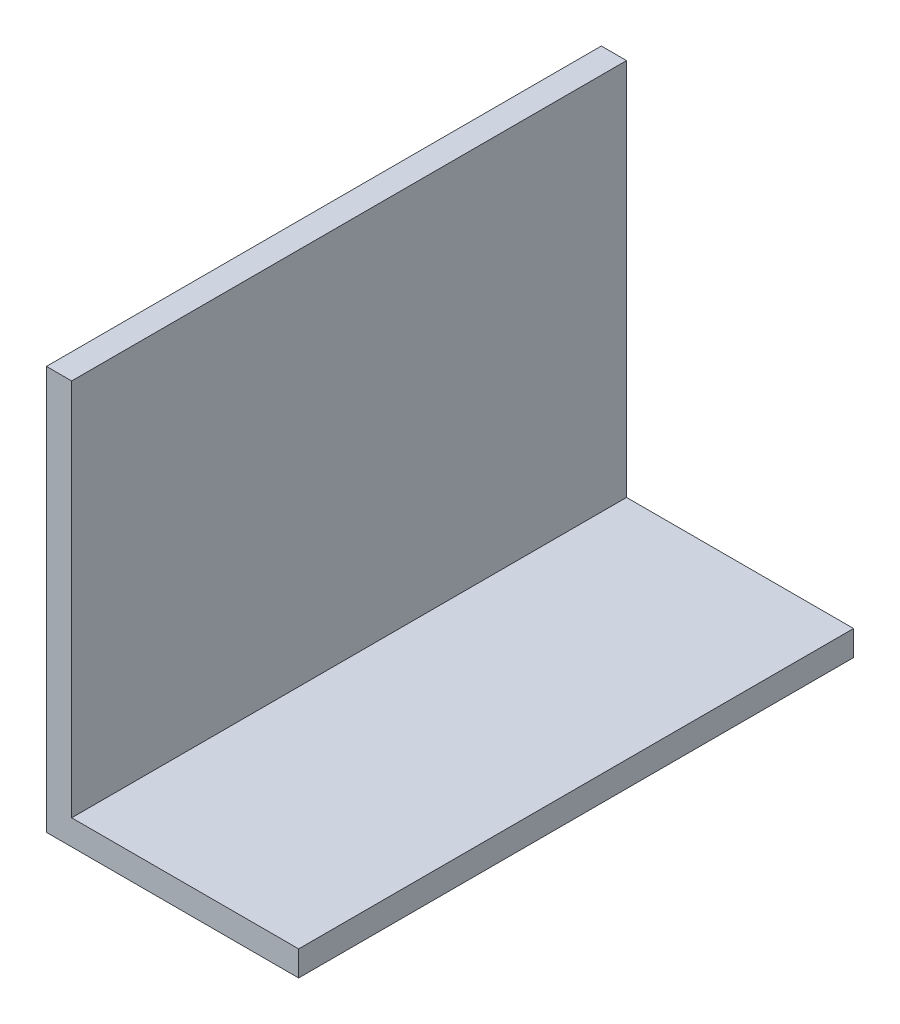
ISO-10303-21;
HEADER;
FILE_DESCRIPTION(('STEP AP214'),'2;1');
FILE_NAME('part.step','',(''),(''),'','','');
FILE_SCHEMA(('AUTOMOTIVE_DESIGN { 1 0 10303 214 1 1 1 1 }'));
ENDSEC;
DATA;
#1=APPLICATION_CONTEXT('core data for automotive mechanical design processes');
#2=APPLICATION_PROTOCOL_DEFINITION('international standard','automotive_design',2000,#1);
#3=PRODUCT_CONTEXT('',#1,'mechanical');
#4=PRODUCT('Part','Part','',(#3));
#5=PRODUCT_RELATED_PRODUCT_CATEGORY('part','',(#4));
#6=PRODUCT_DEFINITION_FORMATION('','',#4);
#7=PRODUCT_DEFINITION_CONTEXT('part definition',#1,'design');
#8=PRODUCT_DEFINITION('design','',#6,#7);
#9=PRODUCT_DEFINITION_SHAPE('','',#8);
#10=(LENGTH_UNIT() NAMED_UNIT(*) SI_UNIT(.MILLI.,.METRE.));
#11=(NAMED_UNIT(*) PLANE_ANGLE_UNIT() SI_UNIT($,.RADIAN.));
#12=(NAMED_UNIT(*) SI_UNIT($,.STERADIAN.) SOLID_ANGLE_UNIT());
#13=UNCERTAINTY_MEASURE_WITH_UNIT(LENGTH_MEASURE(1.E-05),#10,'distance_accuracy_value','');
#14=(GEOMETRIC_REPRESENTATION_CONTEXT(3) GLOBAL_UNCERTAINTY_ASSIGNED_CONTEXT((#13)) GLOBAL_UNIT_ASSIGNED_CONTEXT((#10,
#11,#12)) REPRESENTATION_CONTEXT('',''));
#15=CARTESIAN_POINT('',(0.,0.,0.));
#16=DIRECTION('',(0.,0.,1.));
#17=DIRECTION('',(1.,0.,0.));
#18=AXIS2_PLACEMENT_3D('',#15,#16,#17);
#19=CARTESIAN_POINT('',(5.00000000000001,0.,110.));
#20=DIRECTION('',(0.,-1.,0.));
#21=DIRECTION('',(1.,0.,0.));
#22=AXIS2_PLACEMENT_3D('',#19,#20,#21);
#23=PLANE('',#22);
#24=DIRECTION('',(-1.,0.,0.));
#25=VECTOR('',#24,1.);
#26=CARTESIAN_POINT('',(5.00000000000001,0.,0.));
#27=LINE('',#26,#25);
#28=CARTESIAN_POINT('',(5.00000000000001,0.,0.));
#29=VERTEX_POINT('',#28);
#30=CARTESIAN_POINT('',(0.,0.,0.));
#31=VERTEX_POINT('',#30);
#32=EDGE_CURVE('E128',#29,#31,#27,.T.);
#33=ORIENTED_EDGE('',*,*,#32,.T.);
#34=DIRECTION('',(0.,0.,-1.));
#35=VECTOR('',#34,1.);
#36=CARTESIAN_POINT('',(0.,0.,110.));
#37=LINE('',#36,#35);
#38=CARTESIAN_POINT('',(0.,0.,110.));
#39=VERTEX_POINT('',#38);
#40=EDGE_CURVE('E11',#39,#31,#37,.T.);
#41=ORIENTED_EDGE('',*,*,#40,.F.);
#42=DIRECTION('',(-1.,0.,0.));
#43=VECTOR('',#42,1.);
#44=CARTESIAN_POINT('',(5.00000000000001,0.,110.));
#45=LINE('',#44,#43);
#46=CARTESIAN_POINT('',(5.00000000000001,0.,110.));
#47=VERTEX_POINT('',#46);
#48=EDGE_CURVE('E144',#47,#39,#45,.T.);
#49=ORIENTED_EDGE('',*,*,#48,.F.);
#50=DIRECTION('',(0.,0.,-1.));
#51=VECTOR('',#50,1.);
#52=CARTESIAN_POINT('',(5.00000000000001,0.,110.));
#53=LINE('',#52,#51);
#54=EDGE_CURVE('E124',#47,#29,#53,.T.);
#55=ORIENTED_EDGE('',*,*,#54,.T.);
#56=EDGE_LOOP('',(#33,#41,#49,#55));
#57=FACE_BOUND('',#56,.T.);
#58=ADVANCED_FACE('F39',(#57),#23,.F.);
#59=CARTESIAN_POINT('',(0.,0.,110.));
#60=DIRECTION('',(1.,0.,0.));
#61=DIRECTION('',(0.,1.,0.));
#62=AXIS2_PLACEMENT_3D('',#59,#60,#61);
#63=PLANE('',#62);
#64=DIRECTION('',(0.,-1.,0.));
#65=VECTOR('',#64,1.);
#66=CARTESIAN_POINT('',(0.,0.,0.));
#67=LINE('',#66,#65);
#68=CARTESIAN_POINT('',(0.,-80.,0.));
#69=VERTEX_POINT('',#68);
#70=EDGE_CURVE('E132',#31,#69,#67,.T.);
#71=ORIENTED_EDGE('',*,*,#70,.T.);
#72=DIRECTION('',(0.,0.,-1.));
#73=VECTOR('',#72,1.);
#74=CARTESIAN_POINT('',(0.,-80.,110.));
#75=LINE('',#74,#73);
#76=CARTESIAN_POINT('',(0.,-80.,110.));
#77=VERTEX_POINT('',#76);
#78=EDGE_CURVE('E48',#77,#69,#75,.T.);
#79=ORIENTED_EDGE('',*,*,#78,.F.);
#80=DIRECTION('',(0.,-1.,0.));
#81=VECTOR('',#80,1.);
#82=CARTESIAN_POINT('',(0.,0.,110.));
#83=LINE('',#82,#81);
#84=EDGE_CURVE('E93',#39,#77,#83,.T.);
#85=ORIENTED_EDGE('',*,*,#84,.F.);
#86=ORIENTED_EDGE('',*,*,#40,.T.);
#87=EDGE_LOOP('',(#71,#79,#85,#86));
#88=FACE_BOUND('',#87,.T.);
#89=ADVANCED_FACE('F172',(#88),#63,.F.);
#90=CARTESIAN_POINT('',(0.,-80.,110.));
#91=DIRECTION('',(0.,1.,0.));
#92=DIRECTION('',(0.,0.,1.));
#93=AXIS2_PLACEMENT_3D('',#90,#91,#92);
#94=PLANE('',#93);
#95=DIRECTION('',(1.,0.,0.));
#96=VECTOR('',#95,1.);
#97=CARTESIAN_POINT('',(0.,-80.,0.));
#98=LINE('',#97,#96);
#99=CARTESIAN_POINT('',(50.,-80.,0.));
#100=VERTEX_POINT('',#99);
#101=EDGE_CURVE('E135',#69,#100,#98,.T.);
#102=ORIENTED_EDGE('',*,*,#101,.T.);
#103=DIRECTION('',(0.,0.,-1.));
#104=VECTOR('',#103,1.);
#105=CARTESIAN_POINT('',(50.,-80.,110.));
#106=LINE('',#105,#104);
#107=CARTESIAN_POINT('',(50.,-80.,110.));
#108=VERTEX_POINT('',#107);
#109=EDGE_CURVE('E117',#108,#100,#106,.T.);
#110=ORIENTED_EDGE('',*,*,#109,.F.);
#111=DIRECTION('',(1.,0.,0.));
#112=VECTOR('',#111,1.);
#113=CARTESIAN_POINT('',(0.,-80.,110.));
#114=LINE('',#113,#112);
#115=EDGE_CURVE('E106',#77,#108,#114,.T.);
#116=ORIENTED_EDGE('',*,*,#115,.F.);
#117=ORIENTED_EDGE('',*,*,#78,.T.);
#118=EDGE_LOOP('',(#102,#110,#116,#117));
#119=FACE_BOUND('',#118,.T.);
#120=ADVANCED_FACE('F154',(#119),#94,.F.);
#121=CARTESIAN_POINT('',(50.,-80.,110.));
#122=DIRECTION('',(-1.,0.,0.));
#123=DIRECTION('',(0.,0.,1.));
#124=AXIS2_PLACEMENT_3D('',#121,#122,#123);
#125=PLANE('',#124);
#126=DIRECTION('',(0.,1.,0.));
#127=VECTOR('',#126,1.);
#128=CARTESIAN_POINT('',(50.,-80.,0.));
#129=LINE('',#128,#127);
#130=CARTESIAN_POINT('',(50.,-75.,0.));
#131=VERTEX_POINT('',#130);
#132=EDGE_CURVE('E115',#100,#131,#129,.T.);
#133=ORIENTED_EDGE('',*,*,#132,.T.);
#134=DIRECTION('',(0.,0.,-1.));
#135=VECTOR('',#134,1.);
#136=CARTESIAN_POINT('',(50.,-75.,110.));
#137=LINE('',#136,#135);
#138=CARTESIAN_POINT('',(50.,-75.,110.));
#139=VERTEX_POINT('',#138);
#140=EDGE_CURVE('E112',#139,#131,#137,.T.);
#141=ORIENTED_EDGE('',*,*,#140,.F.);
#142=DIRECTION('',(0.,1.,0.));
#143=VECTOR('',#142,1.);
#144=CARTESIAN_POINT('',(50.,-80.,110.));
#145=LINE('',#144,#143);
#146=EDGE_CURVE('E100',#108,#139,#145,.T.);
#147=ORIENTED_EDGE('',*,*,#146,.F.);
#148=ORIENTED_EDGE('',*,*,#109,.T.);
#149=EDGE_LOOP('',(#133,#141,#147,#148));
#150=FACE_BOUND('',#149,.T.);
#151=ADVANCED_FACE('F113',(#150),#125,.F.);
#152=CARTESIAN_POINT('',(50.,-75.,110.));
#153=DIRECTION('',(0.,-1.,0.));
#154=DIRECTION('',(0.,0.,-1.));
#155=AXIS2_PLACEMENT_3D('',#152,#153,#154);
#156=PLANE('',#155);
#157=DIRECTION('',(-1.,0.,0.));
#158=VECTOR('',#157,1.);
#159=CARTESIAN_POINT('',(50.,-75.,0.));
#160=LINE('',#159,#158);
#161=CARTESIAN_POINT('',(5.00000000000001,-75.,0.));
#162=VERTEX_POINT('',#161);
#163=EDGE_CURVE('E79',#131,#162,#160,.T.);
#164=ORIENTED_EDGE('',*,*,#163,.T.);
#165=DIRECTION('',(0.,0.,-1.));
#166=VECTOR('',#165,1.);
#167=CARTESIAN_POINT('',(5.00000000000001,-75.,110.));
#168=LINE('',#167,#166);
#169=CARTESIAN_POINT('',(5.00000000000001,-75.,110.));
#170=VERTEX_POINT('',#169);
#171=EDGE_CURVE('E118',#170,#162,#168,.T.);
#172=ORIENTED_EDGE('',*,*,#171,.F.);
#173=DIRECTION('',(-1.,0.,0.));
#174=VECTOR('',#173,1.);
#175=CARTESIAN_POINT('',(50.,-75.,110.));
#176=LINE('',#175,#174);
#177=EDGE_CURVE('E104',#139,#170,#176,.T.);
#178=ORIENTED_EDGE('',*,*,#177,.F.);
#179=ORIENTED_EDGE('',*,*,#140,.T.);
#180=EDGE_LOOP('',(#164,#172,#178,#179));
#181=FACE_BOUND('',#180,.T.);
#182=ADVANCED_FACE('F120',(#181),#156,.F.);
#183=CARTESIAN_POINT('',(5.00000000000001,-75.,110.));
#184=DIRECTION('',(-1.,0.,0.));
#185=DIRECTION('',(0.,-1.,0.));
#186=AXIS2_PLACEMENT_3D('',#183,#184,#185);
#187=PLANE('',#186);
#188=DIRECTION('',(0.,1.,0.));
#189=VECTOR('',#188,1.);
#190=CARTESIAN_POINT('',(5.00000000000001,-75.,0.));
#191=LINE('',#190,#189);
#192=EDGE_CURVE('E85',#162,#29,#191,.T.);
#193=ORIENTED_EDGE('',*,*,#192,.T.);
#194=ORIENTED_EDGE('',*,*,#54,.F.);
#195=DIRECTION('',(0.,1.,0.));
#196=VECTOR('',#195,1.);
#197=CARTESIAN_POINT('',(5.00000000000001,-75.,110.));
#198=LINE('',#197,#196);
#199=EDGE_CURVE('E56',#170,#47,#198,.T.);
#200=ORIENTED_EDGE('',*,*,#199,.F.);
#201=ORIENTED_EDGE('',*,*,#171,.T.);
#202=EDGE_LOOP('',(#193,#194,#200,#201));
#203=FACE_BOUND('',#202,.T.);
#204=ADVANCED_FACE('F161',(#203),#187,.F.);
#205=CARTESIAN_POINT('',(0.,0.,110.));
#206=DIRECTION('',(0.,0.,1.));
#207=DIRECTION('',(1.,0.,0.));
#208=AXIS2_PLACEMENT_3D('',#205,#206,#207);
#209=PLANE('',#208);
#210=ORIENTED_EDGE('',*,*,#48,.T.);
#211=ORIENTED_EDGE('',*,*,#84,.T.);
#212=ORIENTED_EDGE('',*,*,#115,.T.);
#213=ORIENTED_EDGE('',*,*,#146,.T.);
#214=ORIENTED_EDGE('',*,*,#177,.T.);
#215=ORIENTED_EDGE('',*,*,#199,.T.);
#216=EDGE_LOOP('',(#210,#211,#212,#213,#214,#215));
#217=FACE_BOUND('',#216,.T.);
#218=ADVANCED_FACE('F102',(#217),#209,.T.);
#219=CARTESIAN_POINT('',(0.,0.,0.));
#220=DIRECTION('',(0.,0.,1.));
#221=DIRECTION('',(1.,0.,0.));
#222=AXIS2_PLACEMENT_3D('',#219,#220,#221);
#223=PLANE('',#222);
#224=ORIENTED_EDGE('',*,*,#32,.F.);
#225=ORIENTED_EDGE('',*,*,#192,.F.);
#226=ORIENTED_EDGE('',*,*,#163,.F.);
#227=ORIENTED_EDGE('',*,*,#132,.F.);
#228=ORIENTED_EDGE('',*,*,#101,.F.);
#229=ORIENTED_EDGE('',*,*,#70,.F.);
#230=EDGE_LOOP('',(#224,#225,#226,#227,#228,#229));
#231=FACE_BOUND('',#230,.T.);
#232=ADVANCED_FACE('F157',(#231),#223,.F.);
#233=CLOSED_SHELL('',(#58,#89,#120,#151,#182,#204,#218,#232));
#234=MANIFOLD_SOLID_BREP('B2',#233);
#235=ADVANCED_BREP_SHAPE_REPRESENTATION('',(#18,#234),#14);
#236=SHAPE_DEFINITION_REPRESENTATION(#9,#235);
ENDSEC;
END-ISO-10303-21;
